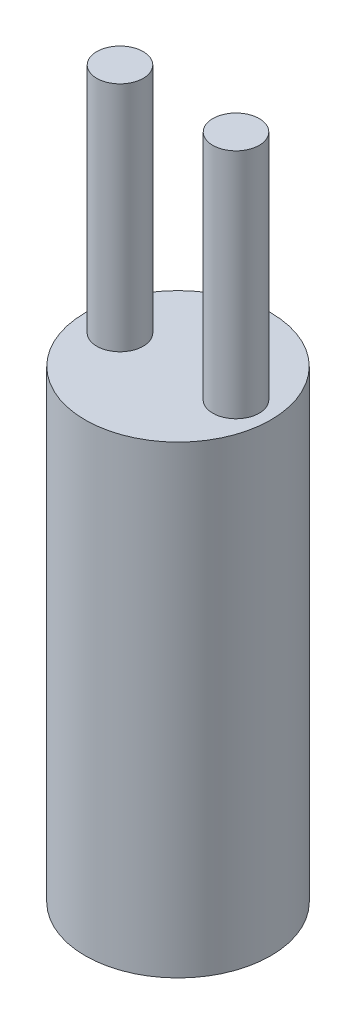
ISO-10303-21;
HEADER;
FILE_DESCRIPTION(('STEP AP214'),'2;1');
FILE_NAME('part.step','',(''),(''),'','','');
FILE_SCHEMA(('AUTOMOTIVE_DESIGN { 1 0 10303 214 1 1 1 1 }'));
ENDSEC;
DATA;
#1=APPLICATION_CONTEXT('core data for automotive mechanical design processes');
#2=APPLICATION_PROTOCOL_DEFINITION('international standard','automotive_design',2000,#1);
#3=PRODUCT_CONTEXT('',#1,'mechanical');
#4=PRODUCT('Part','Part','',(#3));
#5=PRODUCT_RELATED_PRODUCT_CATEGORY('part','',(#4));
#6=PRODUCT_DEFINITION_FORMATION('','',#4);
#7=PRODUCT_DEFINITION_CONTEXT('part definition',#1,'design');
#8=PRODUCT_DEFINITION('design','',#6,#7);
#9=PRODUCT_DEFINITION_SHAPE('','',#8);
#10=(LENGTH_UNIT() NAMED_UNIT(*) SI_UNIT(.MILLI.,.METRE.));
#11=(NAMED_UNIT(*) PLANE_ANGLE_UNIT() SI_UNIT($,.RADIAN.));
#12=(NAMED_UNIT(*) SI_UNIT($,.STERADIAN.) SOLID_ANGLE_UNIT());
#13=UNCERTAINTY_MEASURE_WITH_UNIT(LENGTH_MEASURE(1.E-05),#10,'distance_accuracy_value','');
#14=(GEOMETRIC_REPRESENTATION_CONTEXT(3) GLOBAL_UNCERTAINTY_ASSIGNED_CONTEXT((#13)) GLOBAL_UNIT_ASSIGNED_CONTEXT((#10,
#11,#12)) REPRESENTATION_CONTEXT('',''));
#15=CARTESIAN_POINT('',(0.,0.,0.));
#16=DIRECTION('',(0.,0.,1.));
#17=DIRECTION('',(1.,0.,0.));
#18=AXIS2_PLACEMENT_3D('',#15,#16,#17);
#19=CARTESIAN_POINT('',(0.,20.,0.));
#20=DIRECTION('',(0.,-1.,0.));
#21=DIRECTION('',(0.,0.,-1.));
#22=AXIS2_PLACEMENT_3D('',#19,#20,#21);
#23=CYLINDRICAL_SURFACE('',#22,4.);
#24=CARTESIAN_POINT('',(0.,20.,0.));
#25=DIRECTION('',(0.,1.,0.));
#26=DIRECTION('',(0.,0.,1.));
#27=AXIS2_PLACEMENT_3D('',#24,#25,#26);
#28=CIRCLE('',#27,4.);
#29=CARTESIAN_POINT('',(0.,20.,4.));
#30=VERTEX_POINT('',#29);
#31=EDGE_CURVE('E51',#30,#30,#28,.T.);
#32=ORIENTED_EDGE('',*,*,#31,.F.);
#33=EDGE_LOOP('',(#32));
#34=FACE_BOUND('',#33,.T.);
#35=CARTESIAN_POINT('',(0.,0.,0.));
#36=DIRECTION('',(0.,1.,0.));
#37=DIRECTION('',(0.,0.,1.));
#38=AXIS2_PLACEMENT_3D('',#35,#36,#37);
#39=CIRCLE('',#38,4.);
#40=CARTESIAN_POINT('',(0.,0.,4.));
#41=VERTEX_POINT('',#40);
#42=EDGE_CURVE('E56',#41,#41,#39,.T.);
#43=ORIENTED_EDGE('',*,*,#42,.T.);
#44=EDGE_LOOP('',(#43));
#45=FACE_BOUND('',#44,.T.);
#46=ADVANCED_FACE('F43',(#34,#45),#23,.T.);
#47=CARTESIAN_POINT('',(0.,20.,0.));
#48=DIRECTION('',(0.,1.,0.));
#49=DIRECTION('',(0.,0.,1.));
#50=AXIS2_PLACEMENT_3D('',#47,#48,#49);
#51=PLANE('',#50);
#52=CARTESIAN_POINT('',(2.5,20.,0.));
#53=DIRECTION('',(0.,1.,0.));
#54=DIRECTION('',(0.,0.,1.));
#55=AXIS2_PLACEMENT_3D('',#52,#53,#54);
#56=CIRCLE('',#55,1.);
#57=CARTESIAN_POINT('',(2.5,20.,1.));
#58=VERTEX_POINT('',#57);
#59=EDGE_CURVE('E10',#58,#58,#56,.T.);
#60=ORIENTED_EDGE('',*,*,#59,.F.);
#61=EDGE_LOOP('',(#60));
#62=FACE_BOUND('',#61,.T.);
#63=CARTESIAN_POINT('',(-2.5,20.,0.));
#64=DIRECTION('',(0.,1.,0.));
#65=DIRECTION('',(0.,0.,1.));
#66=AXIS2_PLACEMENT_3D('',#63,#64,#65);
#67=CIRCLE('',#66,1.);
#68=CARTESIAN_POINT('',(-2.5,20.,1.));
#69=VERTEX_POINT('',#68);
#70=EDGE_CURVE('E63',#69,#69,#67,.T.);
#71=ORIENTED_EDGE('',*,*,#70,.F.);
#72=EDGE_LOOP('',(#71));
#73=FACE_BOUND('',#72,.T.);
#74=ORIENTED_EDGE('',*,*,#31,.T.);
#75=EDGE_LOOP('',(#74));
#76=FACE_BOUND('',#75,.T.);
#77=ADVANCED_FACE('F94',(#62,#73,#76),#51,.T.);
#78=CARTESIAN_POINT('',(0.,0.,0.));
#79=DIRECTION('',(0.,1.,0.));
#80=DIRECTION('',(0.,0.,1.));
#81=AXIS2_PLACEMENT_3D('',#78,#79,#80);
#82=PLANE('',#81);
#83=CARTESIAN_POINT('',(0.,0.,0.));
#84=DIRECTION('',(0.,1.,0.));
#85=DIRECTION('',(0.,0.,1.));
#86=AXIS2_PLACEMENT_3D('',#83,#84,#85);
#87=CIRCLE('',#86,0.5);
#88=CARTESIAN_POINT('',(0.,0.,0.5));
#89=VERTEX_POINT('',#88);
#90=EDGE_CURVE('E46',#89,#89,#87,.T.);
#91=ORIENTED_EDGE('',*,*,#90,.T.);
#92=EDGE_LOOP('',(#91));
#93=FACE_BOUND('',#92,.T.);
#94=ORIENTED_EDGE('',*,*,#42,.F.);
#95=EDGE_LOOP('',(#94));
#96=FACE_BOUND('',#95,.T.);
#97=ADVANCED_FACE('F79',(#93,#96),#82,.F.);
#98=CARTESIAN_POINT('',(-2.5,30.,0.));
#99=DIRECTION('',(0.,-1.,0.));
#100=DIRECTION('',(0.,0.,-1.));
#101=AXIS2_PLACEMENT_3D('',#98,#99,#100);
#102=CYLINDRICAL_SURFACE('',#101,1.);
#103=CARTESIAN_POINT('',(-2.5,30.,0.));
#104=DIRECTION('',(0.,1.,0.));
#105=DIRECTION('',(0.,0.,1.));
#106=AXIS2_PLACEMENT_3D('',#103,#104,#105);
#107=CIRCLE('',#106,1.);
#108=CARTESIAN_POINT('',(-2.5,30.,1.));
#109=VERTEX_POINT('',#108);
#110=EDGE_CURVE('E61',#109,#109,#107,.T.);
#111=ORIENTED_EDGE('',*,*,#110,.F.);
#112=EDGE_LOOP('',(#111));
#113=FACE_BOUND('',#112,.T.);
#114=ORIENTED_EDGE('',*,*,#70,.T.);
#115=EDGE_LOOP('',(#114));
#116=FACE_BOUND('',#115,.T.);
#117=ADVANCED_FACE('F105',(#113,#116),#102,.T.);
#118=CARTESIAN_POINT('',(-2.5,30.,0.));
#119=DIRECTION('',(0.,1.,0.));
#120=DIRECTION('',(0.,0.,1.));
#121=AXIS2_PLACEMENT_3D('',#118,#119,#120);
#122=PLANE('',#121);
#123=ORIENTED_EDGE('',*,*,#110,.T.);
#124=EDGE_LOOP('',(#123));
#125=FACE_BOUND('',#124,.T.);
#126=ADVANCED_FACE('F108',(#125),#122,.T.);
#127=CARTESIAN_POINT('',(2.5,30.,0.));
#128=DIRECTION('',(0.,-1.,0.));
#129=DIRECTION('',(0.,0.,-1.));
#130=AXIS2_PLACEMENT_3D('',#127,#128,#129);
#131=CYLINDRICAL_SURFACE('',#130,1.);
#132=CARTESIAN_POINT('',(2.5,30.,0.));
#133=DIRECTION('',(0.,-1.,0.));
#134=DIRECTION('',(0.,0.,1.));
#135=AXIS2_PLACEMENT_3D('',#132,#133,#134);
#136=CIRCLE('',#135,1.);
#137=CARTESIAN_POINT('',(2.5,30.,1.));
#138=VERTEX_POINT('',#137);
#139=EDGE_CURVE('E67',#138,#138,#136,.T.);
#140=ORIENTED_EDGE('',*,*,#139,.T.);
#141=EDGE_LOOP('',(#140));
#142=FACE_BOUND('',#141,.T.);
#143=ORIENTED_EDGE('',*,*,#59,.T.);
#144=EDGE_LOOP('',(#143));
#145=FACE_BOUND('',#144,.T.);
#146=ADVANCED_FACE('F90',(#142,#145),#131,.T.);
#147=CARTESIAN_POINT('',(2.5,30.,0.));
#148=DIRECTION('',(0.,1.,0.));
#149=DIRECTION('',(0.,0.,1.));
#150=AXIS2_PLACEMENT_3D('',#147,#148,#149);
#151=PLANE('',#150);
#152=ORIENTED_EDGE('',*,*,#139,.F.);
#153=EDGE_LOOP('',(#152));
#154=FACE_BOUND('',#153,.T.);
#155=ADVANCED_FACE('F84',(#154),#151,.T.);
#156=CARTESIAN_POINT('',(0.,0.,0.));
#157=DIRECTION('',(0.,0.,1.));
#158=DIRECTION('',(1.,0.,0.));
#159=AXIS2_PLACEMENT_3D('',#156,#157,#158);
#160=SPHERICAL_SURFACE('',#159,0.5);
#161=CARTESIAN_POINT('',(0.,0.,0.));
#162=DIRECTION('',(0.,1.,0.));
#163=DIRECTION('',(0.,0.,1.));
#164=AXIS2_PLACEMENT_3D('',#161,#162,#163);
#165=SPHERICAL_SURFACE('',#164,0.5);
#166=ORIENTED_EDGE('',*,*,#90,.F.);
#167=EDGE_LOOP('',(#166));
#168=FACE_BOUND('',#167,.T.);
#169=ADVANCED_FACE('F82',(#168),#165,.T.);
#170=CLOSED_SHELL('',(#46,#77,#97,#117,#126,#146,#155,#169));
#171=MANIFOLD_SOLID_BREP('B2',#170);
#172=ADVANCED_BREP_SHAPE_REPRESENTATION('',(#18,#171),#14);
#173=SHAPE_DEFINITION_REPRESENTATION(#9,#172);
ENDSEC;
END-ISO-10303-21;
